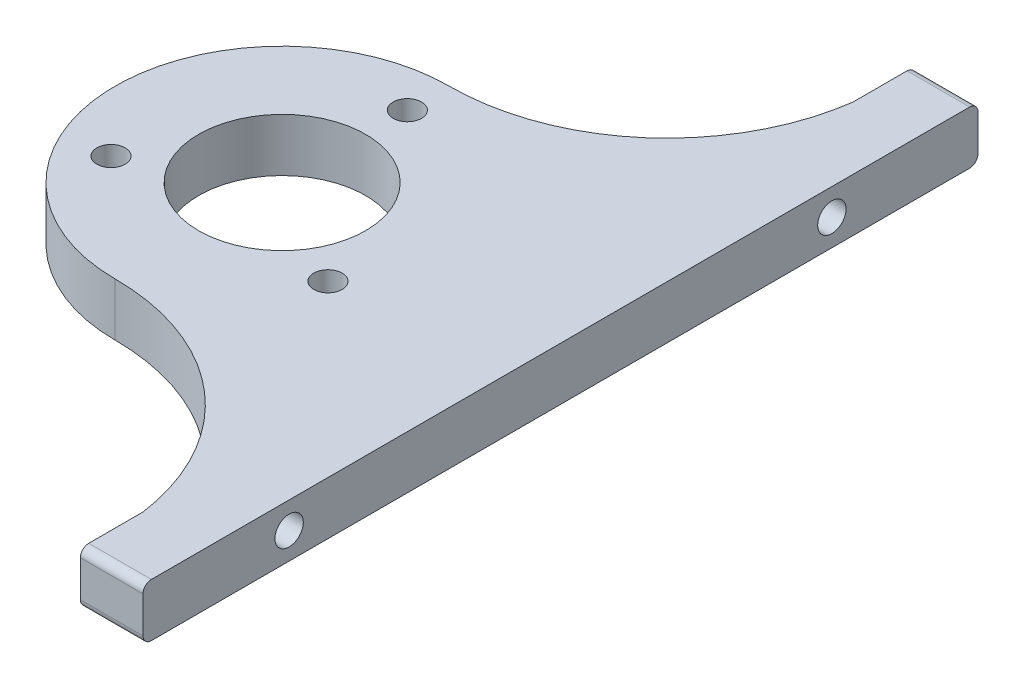
ISO-10303-21;
HEADER;
FILE_DESCRIPTION(('STEP AP214'),'2;1');
FILE_NAME('part.step','',(''),(''),'','','');
FILE_SCHEMA(('AUTOMOTIVE_DESIGN { 1 0 10303 214 1 1 1 1 }'));
ENDSEC;
DATA;
#1=APPLICATION_CONTEXT('core data for automotive mechanical design processes');
#2=APPLICATION_PROTOCOL_DEFINITION('international standard','automotive_design',2000,#1);
#3=PRODUCT_CONTEXT('',#1,'mechanical');
#4=PRODUCT('Part','Part','',(#3));
#5=PRODUCT_RELATED_PRODUCT_CATEGORY('part','',(#4));
#6=PRODUCT_DEFINITION_FORMATION('','',#4);
#7=PRODUCT_DEFINITION_CONTEXT('part definition',#1,'design');
#8=PRODUCT_DEFINITION('design','',#6,#7);
#9=PRODUCT_DEFINITION_SHAPE('','',#8);
#10=(LENGTH_UNIT() NAMED_UNIT(*) SI_UNIT(.MILLI.,.METRE.));
#11=(NAMED_UNIT(*) PLANE_ANGLE_UNIT() SI_UNIT($,.RADIAN.));
#12=(NAMED_UNIT(*) SI_UNIT($,.STERADIAN.) SOLID_ANGLE_UNIT());
#13=UNCERTAINTY_MEASURE_WITH_UNIT(LENGTH_MEASURE(1.E-05),#10,'distance_accuracy_value','');
#14=(GEOMETRIC_REPRESENTATION_CONTEXT(3) GLOBAL_UNCERTAINTY_ASSIGNED_CONTEXT((#13)) GLOBAL_UNIT_ASSIGNED_CONTEXT((#10,
#11,#12)) REPRESENTATION_CONTEXT('',''));
#15=CARTESIAN_POINT('',(0.,0.,0.));
#16=DIRECTION('',(0.,0.,1.));
#17=DIRECTION('',(1.,0.,0.));
#18=AXIS2_PLACEMENT_3D('',#15,#16,#17);
#19=CARTESIAN_POINT('',(0.,6.35,-46.0879022222222));
#20=DIRECTION('',(0.,1.,0.));
#21=DIRECTION('',(0.,0.,1.));
#22=AXIS2_PLACEMENT_3D('',#19,#20,#21);
#23=PLANE('',#22);
#24=CARTESIAN_POINT('',(0.,6.35,-15.));
#25=DIRECTION('',(0.,1.,0.));
#26=DIRECTION('',(0.,0.,1.));
#27=AXIS2_PLACEMENT_3D('',#24,#25,#26);
#28=CIRCLE('',#27,1.7);
#29=CARTESIAN_POINT('',(0.,6.35,-13.3));
#30=VERTEX_POINT('',#29);
#31=EDGE_CURVE('E146',#30,#30,#28,.T.);
#32=ORIENTED_EDGE('',*,*,#31,.F.);
#33=EDGE_LOOP('',(#32));
#34=FACE_BOUND('',#33,.T.);
#35=CARTESIAN_POINT('',(12.9918810567672,6.35,7.49913397459592));
#36=DIRECTION('',(0.,1.,0.));
#37=DIRECTION('',(0.,0.,1.));
#38=AXIS2_PLACEMENT_3D('',#35,#36,#37);
#39=CIRCLE('',#38,1.7);
#40=CARTESIAN_POINT('',(12.9918810567672,6.35,9.19913397459592));
#41=VERTEX_POINT('',#40);
#42=EDGE_CURVE('E152',#41,#41,#39,.T.);
#43=ORIENTED_EDGE('',*,*,#42,.F.);
#44=EDGE_LOOP('',(#43));
#45=FACE_BOUND('',#44,.T.);
#46=CARTESIAN_POINT('',(-12.988881056766,6.35,7.50086602540403));
#47=DIRECTION('',(0.,1.,0.));
#48=DIRECTION('',(0.,0.,1.));
#49=AXIS2_PLACEMENT_3D('',#46,#47,#48);
#50=CIRCLE('',#49,1.7);
#51=CARTESIAN_POINT('',(-12.988881056766,6.35,9.20086602540403));
#52=VERTEX_POINT('',#51);
#53=EDGE_CURVE('E158',#52,#52,#50,.T.);
#54=ORIENTED_EDGE('',*,*,#53,.F.);
#55=EDGE_LOOP('',(#54));
#56=FACE_BOUND('',#55,.T.);
#57=DIRECTION('',(0.,0.,1.));
#58=VECTOR('',#57,1.);
#59=CARTESIAN_POINT('',(25.84,6.35,50.));
#60=LINE('',#59,#58);
#61=CARTESIAN_POINT('',(25.84,6.35,42.5));
#62=VERTEX_POINT('',#61);
#63=CARTESIAN_POINT('',(25.84,6.35,49.));
#64=VERTEX_POINT('',#63);
#65=EDGE_CURVE('E179',#62,#64,#60,.T.);
#66=ORIENTED_EDGE('',*,*,#65,.T.);
#67=DIRECTION('',(1.,0.,0.));
#68=VECTOR('',#67,1.);
#69=CARTESIAN_POINT('',(33.34,6.35,49.));
#70=LINE('',#69,#68);
#71=CARTESIAN_POINT('',(33.34,6.35,49.));
#72=VERTEX_POINT('',#71);
#73=EDGE_CURVE('E226',#64,#72,#70,.T.);
#74=ORIENTED_EDGE('',*,*,#73,.T.);
#75=DIRECTION('',(0.,0.,-1.));
#76=VECTOR('',#75,1.);
#77=CARTESIAN_POINT('',(33.34,6.35,-50.));
#78=LINE('',#77,#76);
#79=CARTESIAN_POINT('',(33.34,6.35,-49.));
#80=VERTEX_POINT('',#79);
#81=EDGE_CURVE('E182',#72,#80,#78,.T.);
#82=ORIENTED_EDGE('',*,*,#81,.T.);
#83=DIRECTION('',(-1.,0.,0.));
#84=VECTOR('',#83,1.);
#85=CARTESIAN_POINT('',(25.84,6.35,-49.));
#86=LINE('',#85,#84);
#87=CARTESIAN_POINT('',(25.84,6.35,-49.));
#88=VERTEX_POINT('',#87);
#89=EDGE_CURVE('E223',#80,#88,#86,.T.);
#90=ORIENTED_EDGE('',*,*,#89,.T.);
#91=DIRECTION('',(0.,0.,1.));
#92=VECTOR('',#91,1.);
#93=CARTESIAN_POINT('',(25.84,6.35,-50.));
#94=LINE('',#93,#92);
#95=CARTESIAN_POINT('',(25.84,6.35,-42.5));
#96=VERTEX_POINT('',#95);
#97=EDGE_CURVE('E185',#88,#96,#94,.T.);
#98=ORIENTED_EDGE('',*,*,#97,.T.);
#99=CARTESIAN_POINT('',(0.,6.35,-46.0879022222222));
#100=DIRECTION('',(0.,-1.,0.));
#101=DIRECTION('',(0.,0.,1.));
#102=AXIS2_PLACEMENT_3D('',#99,#100,#101);
#103=CIRCLE('',#102,26.0879022222222);
#104=CARTESIAN_POINT('',(0.,6.35,-20.));
#105=VERTEX_POINT('',#104);
#106=EDGE_CURVE('E171',#96,#105,#103,.T.);
#107=ORIENTED_EDGE('',*,*,#106,.T.);
#108=CARTESIAN_POINT('',(0.,6.35,0.));
#109=DIRECTION('',(0.,1.,0.));
#110=DIRECTION('',(0.,0.,1.));
#111=AXIS2_PLACEMENT_3D('',#108,#109,#110);
#112=CIRCLE('',#111,20.);
#113=CARTESIAN_POINT('',(0.,6.35,20.));
#114=VERTEX_POINT('',#113);
#115=EDGE_CURVE('E174',#105,#114,#112,.T.);
#116=ORIENTED_EDGE('',*,*,#115,.T.);
#117=CARTESIAN_POINT('',(0.,6.35,46.0879022222222));
#118=DIRECTION('',(0.,-1.,0.));
#119=DIRECTION('',(0.,0.,-1.));
#120=AXIS2_PLACEMENT_3D('',#117,#118,#119);
#121=CIRCLE('',#120,26.0879022222222);
#122=EDGE_CURVE('E177',#114,#62,#121,.T.);
#123=ORIENTED_EDGE('',*,*,#122,.T.);
#124=EDGE_LOOP('',(#66,#74,#82,#90,#98,#107,#116,#123));
#125=FACE_BOUND('',#124,.T.);
#126=CARTESIAN_POINT('',(0.,6.35,0.));
#127=DIRECTION('',(0.,1.,0.));
#128=DIRECTION('',(0.,0.,1.));
#129=AXIS2_PLACEMENT_3D('',#126,#127,#128);
#130=CIRCLE('',#129,10.);
#131=CARTESIAN_POINT('',(0.,6.35,10.));
#132=VERTEX_POINT('',#131);
#133=EDGE_CURVE('E165',#132,#132,#130,.T.);
#134=ORIENTED_EDGE('',*,*,#133,.F.);
#135=EDGE_LOOP('',(#134));
#136=FACE_BOUND('',#135,.T.);
#137=ADVANCED_FACE('F33',(#34,#45,#56,#125,#136),#23,.T.);
#138=CARTESIAN_POINT('',(0.,0.,-46.0879022222222));
#139=DIRECTION('',(0.,1.,0.));
#140=DIRECTION('',(0.,0.,1.));
#141=AXIS2_PLACEMENT_3D('',#138,#139,#140);
#142=PLANE('',#141);
#143=CARTESIAN_POINT('',(0.,0.,-15.));
#144=DIRECTION('',(0.,1.,0.));
#145=DIRECTION('',(0.,0.,1.));
#146=AXIS2_PLACEMENT_3D('',#143,#144,#145);
#147=CIRCLE('',#146,1.7);
#148=CARTESIAN_POINT('',(0.,0.,-13.3));
#149=VERTEX_POINT('',#148);
#150=EDGE_CURVE('E149',#149,#149,#147,.T.);
#151=ORIENTED_EDGE('',*,*,#150,.T.);
#152=EDGE_LOOP('',(#151));
#153=FACE_BOUND('',#152,.T.);
#154=CARTESIAN_POINT('',(12.9918810567672,0.,7.49913397459592));
#155=DIRECTION('',(0.,1.,0.));
#156=DIRECTION('',(0.,0.,1.));
#157=AXIS2_PLACEMENT_3D('',#154,#155,#156);
#158=CIRCLE('',#157,1.7);
#159=CARTESIAN_POINT('',(12.9918810567672,0.,9.19913397459592));
#160=VERTEX_POINT('',#159);
#161=EDGE_CURVE('E155',#160,#160,#158,.T.);
#162=ORIENTED_EDGE('',*,*,#161,.T.);
#163=EDGE_LOOP('',(#162));
#164=FACE_BOUND('',#163,.T.);
#165=CARTESIAN_POINT('',(-12.988881056766,0.,7.50086602540403));
#166=DIRECTION('',(0.,1.,0.));
#167=DIRECTION('',(0.,0.,1.));
#168=AXIS2_PLACEMENT_3D('',#165,#166,#167);
#169=CIRCLE('',#168,1.7);
#170=CARTESIAN_POINT('',(-12.988881056766,0.,9.20086602540403));
#171=VERTEX_POINT('',#170);
#172=EDGE_CURVE('E161',#171,#171,#169,.T.);
#173=ORIENTED_EDGE('',*,*,#172,.T.);
#174=EDGE_LOOP('',(#173));
#175=FACE_BOUND('',#174,.T.);
#176=DIRECTION('',(0.,0.,-1.));
#177=VECTOR('',#176,1.);
#178=CARTESIAN_POINT('',(33.34,0.,-50.));
#179=LINE('',#178,#177);
#180=CARTESIAN_POINT('',(33.34,0.,49.));
#181=VERTEX_POINT('',#180);
#182=CARTESIAN_POINT('',(33.34,0.,-49.));
#183=VERTEX_POINT('',#182);
#184=EDGE_CURVE('E197',#181,#183,#179,.T.);
#185=ORIENTED_EDGE('',*,*,#184,.F.);
#186=DIRECTION('',(1.,0.,0.));
#187=VECTOR('',#186,1.);
#188=CARTESIAN_POINT('',(0.,0.,49.));
#189=LINE('',#188,#187);
#190=CARTESIAN_POINT('',(25.84,0.,49.));
#191=VERTEX_POINT('',#190);
#192=EDGE_CURVE('E248',#181,#191,#189,.F.);
#193=ORIENTED_EDGE('',*,*,#192,.T.);
#194=DIRECTION('',(0.,0.,1.));
#195=VECTOR('',#194,1.);
#196=CARTESIAN_POINT('',(25.84,0.,50.));
#197=LINE('',#196,#195);
#198=CARTESIAN_POINT('',(25.84,0.,42.5));
#199=VERTEX_POINT('',#198);
#200=EDGE_CURVE('E194',#199,#191,#197,.T.);
#201=ORIENTED_EDGE('',*,*,#200,.F.);
#202=CARTESIAN_POINT('',(0.,0.,46.0879022222222));
#203=DIRECTION('',(0.,-1.,0.));
#204=DIRECTION('',(0.,0.,-1.));
#205=AXIS2_PLACEMENT_3D('',#202,#203,#204);
#206=CIRCLE('',#205,26.0879022222222);
#207=CARTESIAN_POINT('',(0.,0.,20.));
#208=VERTEX_POINT('',#207);
#209=EDGE_CURVE('E192',#208,#199,#206,.T.);
#210=ORIENTED_EDGE('',*,*,#209,.F.);
#211=CARTESIAN_POINT('',(0.,0.,0.));
#212=DIRECTION('',(0.,1.,0.));
#213=DIRECTION('',(0.,0.,1.));
#214=AXIS2_PLACEMENT_3D('',#211,#212,#213);
#215=CIRCLE('',#214,20.);
#216=CARTESIAN_POINT('',(0.,0.,-20.));
#217=VERTEX_POINT('',#216);
#218=EDGE_CURVE('E190',#217,#208,#215,.T.);
#219=ORIENTED_EDGE('',*,*,#218,.F.);
#220=CARTESIAN_POINT('',(0.,0.,-46.0879022222222));
#221=DIRECTION('',(0.,-1.,0.));
#222=DIRECTION('',(0.,0.,1.));
#223=AXIS2_PLACEMENT_3D('',#220,#221,#222);
#224=CIRCLE('',#223,26.0879022222222);
#225=CARTESIAN_POINT('',(25.84,0.,-42.5));
#226=VERTEX_POINT('',#225);
#227=EDGE_CURVE('E168',#226,#217,#224,.T.);
#228=ORIENTED_EDGE('',*,*,#227,.F.);
#229=DIRECTION('',(0.,0.,1.));
#230=VECTOR('',#229,1.);
#231=CARTESIAN_POINT('',(25.84,0.,-50.));
#232=LINE('',#231,#230);
#233=CARTESIAN_POINT('',(25.84,0.,-49.));
#234=VERTEX_POINT('',#233);
#235=EDGE_CURVE('E175',#234,#226,#232,.T.);
#236=ORIENTED_EDGE('',*,*,#235,.F.);
#237=DIRECTION('',(-1.,0.,0.));
#238=VECTOR('',#237,1.);
#239=CARTESIAN_POINT('',(0.,0.,-49.));
#240=LINE('',#239,#238);
#241=EDGE_CURVE('E246',#234,#183,#240,.F.);
#242=ORIENTED_EDGE('',*,*,#241,.T.);
#243=EDGE_LOOP('',(#185,#193,#201,#210,#219,#228,#236,#242));
#244=FACE_BOUND('',#243,.T.);
#245=CARTESIAN_POINT('',(0.,0.,0.));
#246=DIRECTION('',(0.,1.,0.));
#247=DIRECTION('',(0.,0.,1.));
#248=AXIS2_PLACEMENT_3D('',#245,#246,#247);
#249=CIRCLE('',#248,10.);
#250=CARTESIAN_POINT('',(0.,0.,10.));
#251=VERTEX_POINT('',#250);
#252=EDGE_CURVE('E164',#251,#251,#249,.T.);
#253=ORIENTED_EDGE('',*,*,#252,.T.);
#254=EDGE_LOOP('',(#253));
#255=FACE_BOUND('',#254,.T.);
#256=ADVANCED_FACE('F264',(#153,#164,#175,#244,#255),#142,.F.);
#257=CARTESIAN_POINT('',(0.,6.35,-46.0879022222222));
#258=DIRECTION('',(0.,-1.,0.));
#259=DIRECTION('',(0.,0.,-1.));
#260=AXIS2_PLACEMENT_3D('',#257,#258,#259);
#261=CYLINDRICAL_SURFACE('',#260,26.0879022222222);
#262=ORIENTED_EDGE('',*,*,#227,.T.);
#263=DIRECTION('',(0.,-1.,0.));
#264=VECTOR('',#263,1.);
#265=CARTESIAN_POINT('',(0.,6.35,-20.));
#266=LINE('',#265,#264);
#267=EDGE_CURVE('E220',#105,#217,#266,.T.);
#268=ORIENTED_EDGE('',*,*,#267,.F.);
#269=ORIENTED_EDGE('',*,*,#106,.F.);
#270=DIRECTION('',(0.,-1.,0.));
#271=VECTOR('',#270,1.);
#272=CARTESIAN_POINT('',(25.84,6.35,-42.5));
#273=LINE('',#272,#271);
#274=EDGE_CURVE('E187',#96,#226,#273,.T.);
#275=ORIENTED_EDGE('',*,*,#274,.T.);
#276=EDGE_LOOP('',(#262,#268,#269,#275));
#277=FACE_BOUND('',#276,.T.);
#278=ADVANCED_FACE('F302',(#277),#261,.F.);
#279=CARTESIAN_POINT('',(0.,6.35,0.));
#280=DIRECTION('',(0.,-1.,0.));
#281=DIRECTION('',(0.,0.,-1.));
#282=AXIS2_PLACEMENT_3D('',#279,#280,#281);
#283=CYLINDRICAL_SURFACE('',#282,20.);
#284=ORIENTED_EDGE('',*,*,#218,.T.);
#285=DIRECTION('',(0.,-1.,0.));
#286=VECTOR('',#285,1.);
#287=CARTESIAN_POINT('',(0.,6.35,20.));
#288=LINE('',#287,#286);
#289=EDGE_CURVE('E217',#114,#208,#288,.T.);
#290=ORIENTED_EDGE('',*,*,#289,.F.);
#291=ORIENTED_EDGE('',*,*,#115,.F.);
#292=ORIENTED_EDGE('',*,*,#267,.T.);
#293=EDGE_LOOP('',(#284,#290,#291,#292));
#294=FACE_BOUND('',#293,.T.);
#295=ADVANCED_FACE('F299',(#294),#283,.T.);
#296=CARTESIAN_POINT('',(0.,6.35,46.0879022222222));
#297=DIRECTION('',(0.,-1.,0.));
#298=DIRECTION('',(0.,0.,-1.));
#299=AXIS2_PLACEMENT_3D('',#296,#297,#298);
#300=CYLINDRICAL_SURFACE('',#299,26.0879022222222);
#301=ORIENTED_EDGE('',*,*,#209,.T.);
#302=DIRECTION('',(0.,-1.,0.));
#303=VECTOR('',#302,1.);
#304=CARTESIAN_POINT('',(25.84,6.35,42.5));
#305=LINE('',#304,#303);
#306=EDGE_CURVE('E214',#62,#199,#305,.T.);
#307=ORIENTED_EDGE('',*,*,#306,.F.);
#308=ORIENTED_EDGE('',*,*,#122,.F.);
#309=ORIENTED_EDGE('',*,*,#289,.T.);
#310=EDGE_LOOP('',(#301,#307,#308,#309));
#311=FACE_BOUND('',#310,.T.);
#312=ADVANCED_FACE('F295',(#311),#300,.F.);
#313=CARTESIAN_POINT('',(25.84,6.35,50.));
#314=DIRECTION('',(1.,0.,0.));
#315=DIRECTION('',(0.,0.,-1.));
#316=AXIS2_PLACEMENT_3D('',#313,#314,#315);
#317=PLANE('',#316);
#318=DIRECTION('',(0.,-1.,0.));
#319=VECTOR('',#318,1.);
#320=CARTESIAN_POINT('',(25.84,6.35,50.));
#321=LINE('',#320,#319);
#322=CARTESIAN_POINT('',(25.84,5.35,50.));
#323=VERTEX_POINT('',#322);
#324=CARTESIAN_POINT('',(25.84,1.,50.));
#325=VERTEX_POINT('',#324);
#326=EDGE_CURVE('E211',#323,#325,#321,.T.);
#327=ORIENTED_EDGE('',*,*,#326,.F.);
#328=CARTESIAN_POINT('',(25.84,5.35,49.));
#329=DIRECTION('',(1.,0.,0.));
#330=DIRECTION('',(0.,0.,-1.));
#331=AXIS2_PLACEMENT_3D('',#328,#329,#330);
#332=CIRCLE('',#331,1.);
#333=EDGE_CURVE('E244',#323,#64,#332,.F.);
#334=ORIENTED_EDGE('',*,*,#333,.T.);
#335=ORIENTED_EDGE('',*,*,#65,.F.);
#336=ORIENTED_EDGE('',*,*,#306,.T.);
#337=ORIENTED_EDGE('',*,*,#200,.T.);
#338=CARTESIAN_POINT('',(25.84,1.,49.));
#339=DIRECTION('',(1.,0.,0.));
#340=DIRECTION('',(0.,0.,-1.));
#341=AXIS2_PLACEMENT_3D('',#338,#339,#340);
#342=CIRCLE('',#341,1.);
#343=EDGE_CURVE('E242',#191,#325,#342,.F.);
#344=ORIENTED_EDGE('',*,*,#343,.T.);
#345=EDGE_LOOP('',(#327,#334,#335,#336,#337,#344));
#346=FACE_BOUND('',#345,.T.);
#347=ADVANCED_FACE('F279',(#346),#317,.F.);
#348=CARTESIAN_POINT('',(33.34,6.35,50.));
#349=DIRECTION('',(0.,0.,-1.));
#350=DIRECTION('',(-1.,0.,0.));
#351=AXIS2_PLACEMENT_3D('',#348,#349,#350);
#352=PLANE('',#351);
#353=DIRECTION('',(0.,-1.,0.));
#354=VECTOR('',#353,1.);
#355=CARTESIAN_POINT('',(33.34,6.35,50.));
#356=LINE('',#355,#354);
#357=CARTESIAN_POINT('',(33.34,5.35,50.));
#358=VERTEX_POINT('',#357);
#359=CARTESIAN_POINT('',(33.34,1.,50.));
#360=VERTEX_POINT('',#359);
#361=EDGE_CURVE('E208',#358,#360,#356,.T.);
#362=ORIENTED_EDGE('',*,*,#361,.F.);
#363=DIRECTION('',(1.,0.,0.));
#364=VECTOR('',#363,1.);
#365=CARTESIAN_POINT('',(25.84,5.35,50.));
#366=LINE('',#365,#364);
#367=EDGE_CURVE('E240',#358,#323,#366,.F.);
#368=ORIENTED_EDGE('',*,*,#367,.T.);
#369=ORIENTED_EDGE('',*,*,#326,.T.);
#370=DIRECTION('',(1.,0.,0.));
#371=VECTOR('',#370,1.);
#372=CARTESIAN_POINT('',(33.34,1.,50.));
#373=LINE('',#372,#371);
#374=EDGE_CURVE('E237',#325,#360,#373,.T.);
#375=ORIENTED_EDGE('',*,*,#374,.T.);
#376=EDGE_LOOP('',(#362,#368,#369,#375));
#377=FACE_BOUND('',#376,.T.);
#378=ADVANCED_FACE('F283',(#377),#352,.F.);
#379=CARTESIAN_POINT('',(33.34,6.35,-50.));
#380=DIRECTION('',(-1.,0.,0.));
#381=DIRECTION('',(0.,0.,1.));
#382=AXIS2_PLACEMENT_3D('',#379,#380,#381);
#383=PLANE('',#382);
#384=CARTESIAN_POINT('',(33.34,3.175,-32.5));
#385=DIRECTION('',(1.,0.,0.));
#386=DIRECTION('',(0.,0.,-1.));
#387=AXIS2_PLACEMENT_3D('',#384,#385,#386);
#388=CIRCLE('',#387,1.69999999999999);
#389=CARTESIAN_POINT('',(33.34,3.175,-34.2));
#390=VERTEX_POINT('',#389);
#391=EDGE_CURVE('E136',#390,#390,#388,.T.);
#392=ORIENTED_EDGE('',*,*,#391,.F.);
#393=EDGE_LOOP('',(#392));
#394=FACE_BOUND('',#393,.T.);
#395=CARTESIAN_POINT('',(33.34,3.17499999999999,32.5));
#396=DIRECTION('',(1.,0.,0.));
#397=DIRECTION('',(0.,0.,-1.));
#398=AXIS2_PLACEMENT_3D('',#395,#396,#397);
#399=CIRCLE('',#398,1.69999999999999);
#400=CARTESIAN_POINT('',(33.34,3.17499999999999,30.8));
#401=VERTEX_POINT('',#400);
#402=EDGE_CURVE('E135',#401,#401,#399,.T.);
#403=ORIENTED_EDGE('',*,*,#402,.F.);
#404=EDGE_LOOP('',(#403));
#405=FACE_BOUND('',#404,.T.);
#406=ORIENTED_EDGE('',*,*,#81,.F.);
#407=CARTESIAN_POINT('',(33.34,5.35,49.));
#408=DIRECTION('',(-1.,0.,0.));
#409=DIRECTION('',(0.,0.,1.));
#410=AXIS2_PLACEMENT_3D('',#407,#408,#409);
#411=CIRCLE('',#410,1.);
#412=EDGE_CURVE('E235',#72,#358,#411,.F.);
#413=ORIENTED_EDGE('',*,*,#412,.T.);
#414=ORIENTED_EDGE('',*,*,#361,.T.);
#415=CARTESIAN_POINT('',(33.34,1.,49.));
#416=DIRECTION('',(-1.,0.,0.));
#417=DIRECTION('',(0.,0.,1.));
#418=AXIS2_PLACEMENT_3D('',#415,#416,#417);
#419=CIRCLE('',#418,1.);
#420=EDGE_CURVE('E233',#360,#181,#419,.F.);
#421=ORIENTED_EDGE('',*,*,#420,.T.);
#422=ORIENTED_EDGE('',*,*,#184,.T.);
#423=CARTESIAN_POINT('',(33.34,1.,-49.));
#424=DIRECTION('',(-1.,0.,0.));
#425=DIRECTION('',(0.,0.,1.));
#426=AXIS2_PLACEMENT_3D('',#423,#424,#425);
#427=CIRCLE('',#426,1.);
#428=CARTESIAN_POINT('',(33.34,1.,-50.));
#429=VERTEX_POINT('',#428);
#430=EDGE_CURVE('E231',#183,#429,#427,.F.);
#431=ORIENTED_EDGE('',*,*,#430,.T.);
#432=DIRECTION('',(0.,-1.,0.));
#433=VECTOR('',#432,1.);
#434=CARTESIAN_POINT('',(33.34,6.35,-50.));
#435=LINE('',#434,#433);
#436=CARTESIAN_POINT('',(33.34,5.35,-50.));
#437=VERTEX_POINT('',#436);
#438=EDGE_CURVE('E205',#437,#429,#435,.T.);
#439=ORIENTED_EDGE('',*,*,#438,.F.);
#440=CARTESIAN_POINT('',(33.34,5.35,-49.));
#441=DIRECTION('',(-1.,0.,0.));
#442=DIRECTION('',(0.,0.,1.));
#443=AXIS2_PLACEMENT_3D('',#440,#441,#442);
#444=CIRCLE('',#443,1.);
#445=EDGE_CURVE('E229',#437,#80,#444,.F.);
#446=ORIENTED_EDGE('',*,*,#445,.T.);
#447=EDGE_LOOP('',(#406,#413,#414,#421,#422,#431,#439,#446));
#448=FACE_BOUND('',#447,.T.);
#449=ADVANCED_FACE('F269',(#394,#405,#448),#383,.F.);
#450=CARTESIAN_POINT('',(33.34,6.35,-50.));
#451=DIRECTION('',(0.,0.,1.));
#452=DIRECTION('',(1.,0.,0.));
#453=AXIS2_PLACEMENT_3D('',#450,#451,#452);
#454=PLANE('',#453);
#455=ORIENTED_EDGE('',*,*,#438,.T.);
#456=DIRECTION('',(-1.,0.,0.));
#457=VECTOR('',#456,1.);
#458=CARTESIAN_POINT('',(33.34,1.,-50.));
#459=LINE('',#458,#457);
#460=CARTESIAN_POINT('',(25.84,1.,-50.));
#461=VERTEX_POINT('',#460);
#462=EDGE_CURVE('E252',#429,#461,#459,.T.);
#463=ORIENTED_EDGE('',*,*,#462,.T.);
#464=DIRECTION('',(0.,-1.,0.));
#465=VECTOR('',#464,1.);
#466=CARTESIAN_POINT('',(25.84,6.35,-50.));
#467=LINE('',#466,#465);
#468=CARTESIAN_POINT('',(25.84,5.35,-50.));
#469=VERTEX_POINT('',#468);
#470=EDGE_CURVE('E203',#469,#461,#467,.T.);
#471=ORIENTED_EDGE('',*,*,#470,.F.);
#472=DIRECTION('',(-1.,0.,0.));
#473=VECTOR('',#472,1.);
#474=CARTESIAN_POINT('',(33.34,5.35,-50.));
#475=LINE('',#474,#473);
#476=EDGE_CURVE('E250',#469,#437,#475,.F.);
#477=ORIENTED_EDGE('',*,*,#476,.T.);
#478=EDGE_LOOP('',(#455,#463,#471,#477));
#479=FACE_BOUND('',#478,.T.);
#480=ADVANCED_FACE('F254',(#479),#454,.F.);
#481=CARTESIAN_POINT('',(25.84,6.35,-50.));
#482=DIRECTION('',(1.,0.,0.));
#483=DIRECTION('',(0.,0.,-1.));
#484=AXIS2_PLACEMENT_3D('',#481,#482,#483);
#485=PLANE('',#484);
#486=ORIENTED_EDGE('',*,*,#470,.T.);
#487=CARTESIAN_POINT('',(25.84,1.,-49.));
#488=DIRECTION('',(1.,0.,0.));
#489=DIRECTION('',(0.,0.,-1.));
#490=AXIS2_PLACEMENT_3D('',#487,#488,#489);
#491=CIRCLE('',#490,1.);
#492=EDGE_CURVE('E11',#461,#234,#491,.F.);
#493=ORIENTED_EDGE('',*,*,#492,.T.);
#494=ORIENTED_EDGE('',*,*,#235,.T.);
#495=ORIENTED_EDGE('',*,*,#274,.F.);
#496=ORIENTED_EDGE('',*,*,#97,.F.);
#497=CARTESIAN_POINT('',(25.84,5.35,-49.));
#498=DIRECTION('',(1.,0.,0.));
#499=DIRECTION('',(0.,0.,-1.));
#500=AXIS2_PLACEMENT_3D('',#497,#498,#499);
#501=CIRCLE('',#500,1.);
#502=EDGE_CURVE('E41',#88,#469,#501,.F.);
#503=ORIENTED_EDGE('',*,*,#502,.T.);
#504=EDGE_LOOP('',(#486,#493,#494,#495,#496,#503));
#505=FACE_BOUND('',#504,.T.);
#506=ADVANCED_FACE('F258',(#505),#485,.F.);
#507=CARTESIAN_POINT('',(0.,6.35,0.));
#508=DIRECTION('',(0.,-1.,0.));
#509=DIRECTION('',(0.,0.,-1.));
#510=AXIS2_PLACEMENT_3D('',#507,#508,#509);
#511=CYLINDRICAL_SURFACE('',#510,10.);
#512=ORIENTED_EDGE('',*,*,#133,.T.);
#513=EDGE_LOOP('',(#512));
#514=FACE_BOUND('',#513,.T.);
#515=ORIENTED_EDGE('',*,*,#252,.F.);
#516=EDGE_LOOP('',(#515));
#517=FACE_BOUND('',#516,.T.);
#518=ADVANCED_FACE('F321',(#514,#517),#511,.F.);
#519=CARTESIAN_POINT('',(-12.988881056766,6.35,7.50086602540403));
#520=DIRECTION('',(0.,1.,0.));
#521=DIRECTION('',(0.,0.,1.));
#522=AXIS2_PLACEMENT_3D('',#519,#520,#521);
#523=CYLINDRICAL_SURFACE('',#522,1.7);
#524=ORIENTED_EDGE('',*,*,#172,.F.);
#525=EDGE_LOOP('',(#524));
#526=FACE_BOUND('',#525,.T.);
#527=ORIENTED_EDGE('',*,*,#53,.T.);
#528=EDGE_LOOP('',(#527));
#529=FACE_BOUND('',#528,.T.);
#530=ADVANCED_FACE('F410',(#526,#529),#523,.F.);
#531=CARTESIAN_POINT('',(12.9918810567672,6.35,7.49913397459592));
#532=DIRECTION('',(0.,1.,0.));
#533=DIRECTION('',(0.,0.,1.));
#534=AXIS2_PLACEMENT_3D('',#531,#532,#533);
#535=CYLINDRICAL_SURFACE('',#534,1.7);
#536=ORIENTED_EDGE('',*,*,#161,.F.);
#537=EDGE_LOOP('',(#536));
#538=FACE_BOUND('',#537,.T.);
#539=ORIENTED_EDGE('',*,*,#42,.T.);
#540=EDGE_LOOP('',(#539));
#541=FACE_BOUND('',#540,.T.);
#542=ADVANCED_FACE('F401',(#538,#541),#535,.F.);
#543=CARTESIAN_POINT('',(0.,6.35,-15.));
#544=DIRECTION('',(0.,1.,0.));
#545=DIRECTION('',(0.,0.,1.));
#546=AXIS2_PLACEMENT_3D('',#543,#544,#545);
#547=CYLINDRICAL_SURFACE('',#546,1.7);
#548=ORIENTED_EDGE('',*,*,#150,.F.);
#549=EDGE_LOOP('',(#548));
#550=FACE_BOUND('',#549,.T.);
#551=ORIENTED_EDGE('',*,*,#31,.T.);
#552=EDGE_LOOP('',(#551));
#553=FACE_BOUND('',#552,.T.);
#554=ADVANCED_FACE('F392',(#550,#553),#547,.F.);
#555=CARTESIAN_POINT('',(26.34,3.17499999999999,32.5));
#556=DIRECTION('',(1.,0.,0.));
#557=DIRECTION('',(0.,0.,-1.));
#558=AXIS2_PLACEMENT_3D('',#555,#556,#557);
#559=CONICAL_SURFACE('',#558,1.69999999999999,1.02974425867665);
#560=CARTESIAN_POINT('',(25.3185369476532,3.17499999999999,32.5));
#561=VERTEX_POINT('',#560);
#562=VERTEX_LOOP('',#561);
#563=FACE_BOUND('',#562,.T.);
#564=CARTESIAN_POINT('',(26.34,3.17499999999999,32.5));
#565=DIRECTION('',(1.,0.,0.));
#566=DIRECTION('',(0.,0.,-1.));
#567=AXIS2_PLACEMENT_3D('',#564,#565,#566);
#568=CIRCLE('',#567,1.69999999999999);
#569=CARTESIAN_POINT('',(26.34,3.17499999999999,30.8));
#570=VERTEX_POINT('',#569);
#571=EDGE_CURVE('E139',#570,#570,#568,.T.);
#572=ORIENTED_EDGE('',*,*,#571,.T.);
#573=EDGE_LOOP('',(#572));
#574=FACE_BOUND('',#573,.T.);
#575=ADVANCED_FACE('F383',(#563,#574),#559,.F.);
#576=CARTESIAN_POINT('',(33.34,3.17499999999999,32.5));
#577=DIRECTION('',(1.,0.,0.));
#578=DIRECTION('',(0.,0.,-1.));
#579=AXIS2_PLACEMENT_3D('',#576,#577,#578);
#580=CYLINDRICAL_SURFACE('',#579,1.69999999999999);
#581=ORIENTED_EDGE('',*,*,#571,.F.);
#582=EDGE_LOOP('',(#581));
#583=FACE_BOUND('',#582,.T.);
#584=ORIENTED_EDGE('',*,*,#402,.T.);
#585=EDGE_LOOP('',(#584));
#586=FACE_BOUND('',#585,.T.);
#587=ADVANCED_FACE('F129',(#583,#586),#580,.F.);
#588=CARTESIAN_POINT('',(26.34,3.175,-32.5));
#589=DIRECTION('',(1.,0.,0.));
#590=DIRECTION('',(0.,0.,-1.));
#591=AXIS2_PLACEMENT_3D('',#588,#589,#590);
#592=CONICAL_SURFACE('',#591,1.69999999999999,1.02974425867665);
#593=CARTESIAN_POINT('',(25.3185369476532,3.175,-32.5));
#594=VERTEX_POINT('',#593);
#595=VERTEX_LOOP('',#594);
#596=FACE_BOUND('',#595,.T.);
#597=CARTESIAN_POINT('',(26.34,3.175,-32.5));
#598=DIRECTION('',(1.,0.,0.));
#599=DIRECTION('',(0.,0.,-1.));
#600=AXIS2_PLACEMENT_3D('',#597,#598,#599);
#601=CIRCLE('',#600,1.69999999999999);
#602=CARTESIAN_POINT('',(26.34,3.175,-34.2));
#603=VERTEX_POINT('',#602);
#604=EDGE_CURVE('E133',#603,#603,#601,.T.);
#605=ORIENTED_EDGE('',*,*,#604,.T.);
#606=EDGE_LOOP('',(#605));
#607=FACE_BOUND('',#606,.T.);
#608=ADVANCED_FACE('F125',(#596,#607),#592,.F.);
#609=CARTESIAN_POINT('',(33.34,3.175,-32.5));
#610=DIRECTION('',(1.,0.,0.));
#611=DIRECTION('',(0.,0.,-1.));
#612=AXIS2_PLACEMENT_3D('',#609,#610,#611);
#613=CYLINDRICAL_SURFACE('',#612,1.69999999999999);
#614=ORIENTED_EDGE('',*,*,#604,.F.);
#615=EDGE_LOOP('',(#614));
#616=FACE_BOUND('',#615,.T.);
#617=ORIENTED_EDGE('',*,*,#391,.T.);
#618=EDGE_LOOP('',(#617));
#619=FACE_BOUND('',#618,.T.);
#620=ADVANCED_FACE('F128',(#616,#619),#613,.F.);
#621=CARTESIAN_POINT('',(0.,5.35,49.));
#622=DIRECTION('',(-1.,0.,0.));
#623=DIRECTION('',(0.,0.,1.));
#624=AXIS2_PLACEMENT_3D('',#621,#622,#623);
#625=CYLINDRICAL_SURFACE('',#624,1.);
#626=ORIENTED_EDGE('',*,*,#333,.F.);
#627=ORIENTED_EDGE('',*,*,#367,.F.);
#628=ORIENTED_EDGE('',*,*,#412,.F.);
#629=ORIENTED_EDGE('',*,*,#73,.F.);
#630=EDGE_LOOP('',(#626,#627,#628,#629));
#631=FACE_BOUND('',#630,.T.);
#632=ADVANCED_FACE('F286',(#631),#625,.T.);
#633=CARTESIAN_POINT('',(33.34,1.,49.));
#634=DIRECTION('',(1.,0.,0.));
#635=DIRECTION('',(0.,0.,-1.));
#636=AXIS2_PLACEMENT_3D('',#633,#634,#635);
#637=CYLINDRICAL_SURFACE('',#636,1.);
#638=ORIENTED_EDGE('',*,*,#343,.F.);
#639=ORIENTED_EDGE('',*,*,#192,.F.);
#640=ORIENTED_EDGE('',*,*,#420,.F.);
#641=ORIENTED_EDGE('',*,*,#374,.F.);
#642=EDGE_LOOP('',(#638,#639,#640,#641));
#643=FACE_BOUND('',#642,.T.);
#644=ADVANCED_FACE('F275',(#643),#637,.T.);
#645=CARTESIAN_POINT('',(33.34,1.,-49.));
#646=DIRECTION('',(-1.,0.,0.));
#647=DIRECTION('',(0.,0.,1.));
#648=AXIS2_PLACEMENT_3D('',#645,#646,#647);
#649=CYLINDRICAL_SURFACE('',#648,1.);
#650=ORIENTED_EDGE('',*,*,#430,.F.);
#651=ORIENTED_EDGE('',*,*,#241,.F.);
#652=ORIENTED_EDGE('',*,*,#492,.F.);
#653=ORIENTED_EDGE('',*,*,#462,.F.);
#654=EDGE_LOOP('',(#650,#651,#652,#653));
#655=FACE_BOUND('',#654,.T.);
#656=ADVANCED_FACE('F266',(#655),#649,.T.);
#657=CARTESIAN_POINT('',(0.,5.35,-49.));
#658=DIRECTION('',(1.,0.,0.));
#659=DIRECTION('',(0.,0.,-1.));
#660=AXIS2_PLACEMENT_3D('',#657,#658,#659);
#661=CYLINDRICAL_SURFACE('',#660,1.);
#662=ORIENTED_EDGE('',*,*,#445,.F.);
#663=ORIENTED_EDGE('',*,*,#476,.F.);
#664=ORIENTED_EDGE('',*,*,#502,.F.);
#665=ORIENTED_EDGE('',*,*,#89,.F.);
#666=EDGE_LOOP('',(#662,#663,#664,#665));
#667=FACE_BOUND('',#666,.T.);
#668=ADVANCED_FACE('F35',(#667),#661,.T.);
#669=CLOSED_SHELL('',(#137,#256,#278,#295,#312,#347,#378,#449,#480,#506,#518,#530,#542,#554,
#575,#587,#608,#620,#632,#644,#656,#668));
#670=MANIFOLD_SOLID_BREP('B2',#669);
#671=ADVANCED_BREP_SHAPE_REPRESENTATION('',(#18,#670),#14);
#672=SHAPE_DEFINITION_REPRESENTATION(#9,#671);
ENDSEC;
END-ISO-10303-21;
